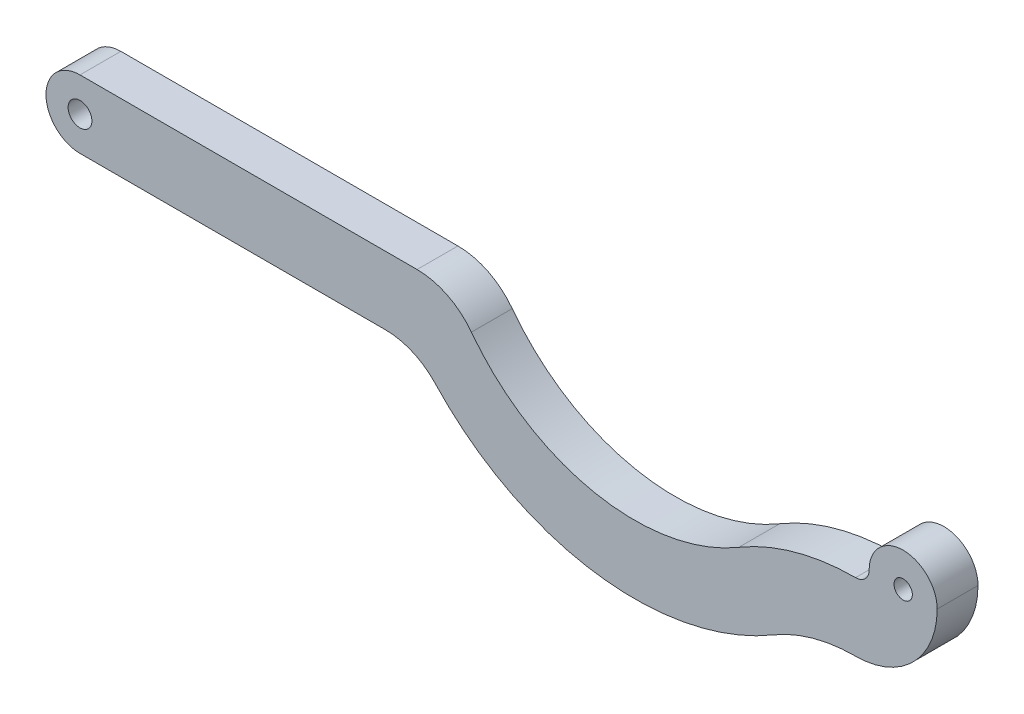
ISO-10303-21;
HEADER;
FILE_DESCRIPTION(('STEP AP214'),'2;1');
FILE_NAME('part.step','',(''),(''),'','','');
FILE_SCHEMA(('AUTOMOTIVE_DESIGN { 1 0 10303 214 1 1 1 1 }'));
ENDSEC;
DATA;
#1=APPLICATION_CONTEXT('core data for automotive mechanical design processes');
#2=APPLICATION_PROTOCOL_DEFINITION('international standard','automotive_design',2000,#1);
#3=PRODUCT_CONTEXT('',#1,'mechanical');
#4=PRODUCT('Part','Part','',(#3));
#5=PRODUCT_RELATED_PRODUCT_CATEGORY('part','',(#4));
#6=PRODUCT_DEFINITION_FORMATION('','',#4);
#7=PRODUCT_DEFINITION_CONTEXT('part definition',#1,'design');
#8=PRODUCT_DEFINITION('design','',#6,#7);
#9=PRODUCT_DEFINITION_SHAPE('','',#8);
#10=(LENGTH_UNIT() NAMED_UNIT(*) SI_UNIT(.MILLI.,.METRE.));
#11=(NAMED_UNIT(*) PLANE_ANGLE_UNIT() SI_UNIT($,.RADIAN.));
#12=(NAMED_UNIT(*) SI_UNIT($,.STERADIAN.) SOLID_ANGLE_UNIT());
#13=UNCERTAINTY_MEASURE_WITH_UNIT(LENGTH_MEASURE(1.E-05),#10,'distance_accuracy_value','');
#14=(GEOMETRIC_REPRESENTATION_CONTEXT(3) GLOBAL_UNCERTAINTY_ASSIGNED_CONTEXT((#13)) GLOBAL_UNIT_ASSIGNED_CONTEXT((#10,
#11,#12)) REPRESENTATION_CONTEXT('',''));
#15=CARTESIAN_POINT('',(0.,0.,0.));
#16=DIRECTION('',(0.,0.,1.));
#17=DIRECTION('',(1.,0.,0.));
#18=AXIS2_PLACEMENT_3D('',#15,#16,#17);
#19=CARTESIAN_POINT('',(114.000002516936,-30.5588194241385,6.));
#20=DIRECTION('',(0.,0.,-1.));
#21=DIRECTION('',(-1.,0.,0.));
#22=AXIS2_PLACEMENT_3D('',#19,#20,#21);
#23=CYLINDRICAL_SURFACE('',#22,23.5588194241386);
#24=CARTESIAN_POINT('',(114.000002516936,-30.5588194241385,0.));
#25=DIRECTION('',(0.,0.,1.));
#26=DIRECTION('',(1.,0.,0.));
#27=AXIS2_PLACEMENT_3D('',#24,#25,#26);
#28=CIRCLE('',#27,23.5588194241386);
#29=CARTESIAN_POINT('',(114.000000849388,-6.99999999999999,0.));
#30=VERTEX_POINT('',#29);
#31=CARTESIAN_POINT('',(101.953496657991,-10.3128403356982,0.));
#32=VERTEX_POINT('',#31);
#33=EDGE_CURVE('E137',#30,#32,#28,.T.);
#34=ORIENTED_EDGE('',*,*,#33,.F.);
#35=DIRECTION('',(0.,0.,-1.));
#36=VECTOR('',#35,1.);
#37=CARTESIAN_POINT('',(114.000000849388,-6.99999999999999,6.));
#38=LINE('',#37,#36);
#39=CARTESIAN_POINT('',(114.000000849388,-6.99999999999999,6.));
#40=VERTEX_POINT('',#39);
#41=EDGE_CURVE('E132',#40,#30,#38,.T.);
#42=ORIENTED_EDGE('',*,*,#41,.F.);
#43=CARTESIAN_POINT('',(114.000002516936,-30.5588194241385,6.));
#44=DIRECTION('',(0.,0.,1.));
#45=DIRECTION('',(1.,0.,0.));
#46=AXIS2_PLACEMENT_3D('',#43,#44,#45);
#47=CIRCLE('',#46,23.5588194241386);
#48=CARTESIAN_POINT('',(101.953496657991,-10.3128403356982,6.));
#49=VERTEX_POINT('',#48);
#50=EDGE_CURVE('E135',#40,#49,#47,.T.);
#51=ORIENTED_EDGE('',*,*,#50,.T.);
#52=DIRECTION('',(0.,0.,-1.));
#53=VECTOR('',#52,1.);
#54=CARTESIAN_POINT('',(101.953496657991,-10.3128403356982,6.));
#55=LINE('',#54,#53);
#56=EDGE_CURVE('E197',#49,#32,#55,.T.);
#57=ORIENTED_EDGE('',*,*,#56,.T.);
#58=EDGE_LOOP('',(#34,#42,#51,#57));
#59=FACE_BOUND('',#58,.T.);
#60=ADVANCED_FACE('F43',(#59),#23,.F.);
#61=CARTESIAN_POINT('',(114.,5.,6.));
#62=DIRECTION('',(0.,0.,-1.));
#63=DIRECTION('',(-1.,0.,0.));
#64=AXIS2_PLACEMENT_3D('',#61,#62,#63);
#65=CYLINDRICAL_SURFACE('',#64,12.);
#66=CARTESIAN_POINT('',(114.,5.,0.));
#67=DIRECTION('',(0.,0.,1.));
#68=DIRECTION('',(1.,0.,0.));
#69=AXIS2_PLACEMENT_3D('',#66,#67,#68);
#70=CIRCLE('',#69,12.);
#71=CARTESIAN_POINT('',(126.,5.,0.));
#72=VERTEX_POINT('',#71);
#73=EDGE_CURVE('E200',#72,#30,#70,.F.);
#74=ORIENTED_EDGE('',*,*,#73,.F.);
#75=DIRECTION('',(0.,0.,-1.));
#76=VECTOR('',#75,1.);
#77=CARTESIAN_POINT('',(126.,5.,6.));
#78=LINE('',#77,#76);
#79=CARTESIAN_POINT('',(126.,5.,6.));
#80=VERTEX_POINT('',#79);
#81=EDGE_CURVE('E144',#80,#72,#78,.T.);
#82=ORIENTED_EDGE('',*,*,#81,.F.);
#83=CARTESIAN_POINT('',(114.,5.,6.));
#84=DIRECTION('',(0.,0.,1.));
#85=DIRECTION('',(1.,0.,0.));
#86=AXIS2_PLACEMENT_3D('',#83,#84,#85);
#87=CIRCLE('',#86,12.);
#88=EDGE_CURVE('E151',#80,#40,#87,.F.);
#89=ORIENTED_EDGE('',*,*,#88,.T.);
#90=ORIENTED_EDGE('',*,*,#41,.T.);
#91=EDGE_LOOP('',(#74,#82,#89,#90));
#92=FACE_BOUND('',#91,.T.);
#93=ADVANCED_FACE('F159',(#92),#65,.T.);
#94=CARTESIAN_POINT('',(121.,5.,6.));
#95=DIRECTION('',(0.,0.,-1.));
#96=DIRECTION('',(-1.,0.,0.));
#97=AXIS2_PLACEMENT_3D('',#94,#95,#96);
#98=CYLINDRICAL_SURFACE('',#97,5.);
#99=CARTESIAN_POINT('',(121.,5.,0.));
#100=DIRECTION('',(0.,0.,1.));
#101=DIRECTION('',(1.,0.,0.));
#102=AXIS2_PLACEMENT_3D('',#99,#100,#101);
#103=CIRCLE('',#102,5.);
#104=CARTESIAN_POINT('',(116.,5.00000000000002,0.));
#105=VERTEX_POINT('',#104);
#106=EDGE_CURVE('E203',#105,#72,#103,.F.);
#107=ORIENTED_EDGE('',*,*,#106,.F.);
#108=DIRECTION('',(0.,0.,-1.));
#109=VECTOR('',#108,1.);
#110=CARTESIAN_POINT('',(116.,5.00000000000002,6.));
#111=LINE('',#110,#109);
#112=CARTESIAN_POINT('',(116.,5.00000000000002,6.));
#113=VERTEX_POINT('',#112);
#114=EDGE_CURVE('E246',#113,#105,#111,.T.);
#115=ORIENTED_EDGE('',*,*,#114,.F.);
#116=CARTESIAN_POINT('',(121.,5.,6.));
#117=DIRECTION('',(0.,0.,1.));
#118=DIRECTION('',(1.,0.,0.));
#119=AXIS2_PLACEMENT_3D('',#116,#117,#118);
#120=CIRCLE('',#119,5.);
#121=EDGE_CURVE('E161',#113,#80,#120,.F.);
#122=ORIENTED_EDGE('',*,*,#121,.T.);
#123=ORIENTED_EDGE('',*,*,#81,.T.);
#124=EDGE_LOOP('',(#107,#115,#122,#123));
#125=FACE_BOUND('',#124,.T.);
#126=ADVANCED_FACE('F302',(#125),#98,.T.);
#127=CARTESIAN_POINT('',(114.,5.,6.));
#128=DIRECTION('',(0.,0.,-1.));
#129=DIRECTION('',(-1.,0.,0.));
#130=AXIS2_PLACEMENT_3D('',#127,#128,#129);
#131=CYLINDRICAL_SURFACE('',#130,2.00000000000009);
#132=CARTESIAN_POINT('',(114.,5.,0.));
#133=DIRECTION('',(0.,0.,1.));
#134=DIRECTION('',(1.,0.,0.));
#135=AXIS2_PLACEMENT_3D('',#132,#133,#134);
#136=CIRCLE('',#135,2.00000000000009);
#137=CARTESIAN_POINT('',(114.000000849388,3.00000000000009,0.));
#138=VERTEX_POINT('',#137);
#139=EDGE_CURVE('E207',#105,#138,#136,.F.);
#140=ORIENTED_EDGE('',*,*,#139,.T.);
#141=DIRECTION('',(0.,0.,-1.));
#142=VECTOR('',#141,1.);
#143=CARTESIAN_POINT('',(114.000000849388,3.00000000000009,6.));
#144=LINE('',#143,#142);
#145=CARTESIAN_POINT('',(114.000000849388,3.00000000000009,6.));
#146=VERTEX_POINT('',#145);
#147=EDGE_CURVE('E243',#146,#138,#144,.T.);
#148=ORIENTED_EDGE('',*,*,#147,.F.);
#149=CARTESIAN_POINT('',(114.,5.,6.));
#150=DIRECTION('',(0.,0.,1.));
#151=DIRECTION('',(1.,0.,0.));
#152=AXIS2_PLACEMENT_3D('',#149,#150,#151);
#153=CIRCLE('',#152,2.00000000000009);
#154=EDGE_CURVE('E164',#113,#146,#153,.F.);
#155=ORIENTED_EDGE('',*,*,#154,.F.);
#156=ORIENTED_EDGE('',*,*,#114,.T.);
#157=EDGE_LOOP('',(#140,#148,#155,#156));
#158=FACE_BOUND('',#157,.T.);
#159=ADVANCED_FACE('F307',(#158),#131,.F.);
#160=CARTESIAN_POINT('',(114.000015101656,-30.5588651860256,6.));
#161=DIRECTION('',(0.,0.,-1.));
#162=DIRECTION('',(-1.,0.,0.));
#163=AXIS2_PLACEMENT_3D('',#160,#161,#162);
#164=CYLINDRICAL_SURFACE('',#163,33.5588651860298);
#165=CARTESIAN_POINT('',(114.000015101656,-30.5588651860256,0.));
#166=DIRECTION('',(0.,0.,1.));
#167=DIRECTION('',(1.,0.,0.));
#168=AXIS2_PLACEMENT_3D('',#165,#166,#167);
#169=CIRCLE('',#168,33.5588651860298);
#170=CARTESIAN_POINT('',(96.8401173887535,-1.71904301152354,0.));
#171=VERTEX_POINT('',#170);
#172=EDGE_CURVE('E211',#171,#138,#169,.F.);
#173=ORIENTED_EDGE('',*,*,#172,.F.);
#174=DIRECTION('',(0.,0.,-1.));
#175=VECTOR('',#174,1.);
#176=CARTESIAN_POINT('',(96.8401173887535,-1.71904301152354,6.));
#177=LINE('',#176,#175);
#178=CARTESIAN_POINT('',(96.8401173887535,-1.71904301152354,6.));
#179=VERTEX_POINT('',#178);
#180=EDGE_CURVE('E239',#179,#171,#177,.T.);
#181=ORIENTED_EDGE('',*,*,#180,.F.);
#182=CARTESIAN_POINT('',(114.000015101656,-30.5588651860256,6.));
#183=DIRECTION('',(0.,0.,1.));
#184=DIRECTION('',(1.,0.,0.));
#185=AXIS2_PLACEMENT_3D('',#182,#183,#184);
#186=CIRCLE('',#185,33.5588651860298);
#187=EDGE_CURVE('E169',#179,#146,#186,.F.);
#188=ORIENTED_EDGE('',*,*,#187,.T.);
#189=ORIENTED_EDGE('',*,*,#147,.T.);
#190=EDGE_LOOP('',(#173,#181,#188,#189));
#191=FACE_BOUND('',#190,.T.);
#192=ADVANCED_FACE('F311',(#191),#164,.T.);
#193=CARTESIAN_POINT('',(81.5,24.0623611104252,6.));
#194=DIRECTION('',(0.,0.,-1.));
#195=DIRECTION('',(-1.,0.,0.));
#196=AXIS2_PLACEMENT_3D('',#193,#194,#195);
#197=CYLINDRICAL_SURFACE('',#196,29.9999999999996);
#198=CARTESIAN_POINT('',(81.5,24.0623611104252,0.));
#199=DIRECTION('',(0.,0.,1.));
#200=DIRECTION('',(1.,0.,0.));
#201=AXIS2_PLACEMENT_3D('',#198,#199,#200);
#202=CIRCLE('',#201,29.9999999999996);
#203=CARTESIAN_POINT('',(57.5351494369839,6.01559027760638,0.));
#204=VERTEX_POINT('',#203);
#205=EDGE_CURVE('E215',#204,#171,#202,.T.);
#206=ORIENTED_EDGE('',*,*,#205,.F.);
#207=DIRECTION('',(0.,0.,-1.));
#208=VECTOR('',#207,1.);
#209=CARTESIAN_POINT('',(57.5351494369839,6.01559027760638,6.));
#210=LINE('',#209,#208);
#211=CARTESIAN_POINT('',(57.5351494369839,6.01559027760638,6.));
#212=VERTEX_POINT('',#211);
#213=EDGE_CURVE('E59',#204,#212,#210,.F.);
#214=ORIENTED_EDGE('',*,*,#213,.T.);
#215=CARTESIAN_POINT('',(81.5,24.0623611104252,6.));
#216=DIRECTION('',(0.,0.,1.));
#217=DIRECTION('',(1.,0.,0.));
#218=AXIS2_PLACEMENT_3D('',#215,#216,#217);
#219=CIRCLE('',#218,29.9999999999996);
#220=EDGE_CURVE('E173',#212,#179,#219,.T.);
#221=ORIENTED_EDGE('',*,*,#220,.T.);
#222=ORIENTED_EDGE('',*,*,#180,.T.);
#223=EDGE_LOOP('',(#206,#214,#221,#222));
#224=FACE_BOUND('',#223,.T.);
#225=ADVANCED_FACE('F312',(#224),#197,.F.);
#226=CARTESIAN_POINT('',(0.,10.,6.));
#227=DIRECTION('',(0.,1.,0.));
#228=DIRECTION('',(0.,0.,1.));
#229=AXIS2_PLACEMENT_3D('',#226,#227,#228);
#230=PLANE('',#229);
#231=DIRECTION('',(1.,0.,0.));
#232=VECTOR('',#231,1.);
#233=CARTESIAN_POINT('',(0.,10.,6.));
#234=LINE('',#233,#232);
#235=CARTESIAN_POINT('',(0.,10.,6.));
#236=VERTEX_POINT('',#235);
#237=CARTESIAN_POINT('',(49.5468659159784,10.,6.));
#238=VERTEX_POINT('',#237);
#239=EDGE_CURVE('E176',#236,#238,#234,.T.);
#240=ORIENTED_EDGE('',*,*,#239,.T.);
#241=DIRECTION('',(0.,0.,-1.));
#242=VECTOR('',#241,1.);
#243=CARTESIAN_POINT('',(49.5468659159784,10.,6.));
#244=LINE('',#243,#242);
#245=CARTESIAN_POINT('',(49.5468659159784,10.,0.));
#246=VERTEX_POINT('',#245);
#247=EDGE_CURVE('E273',#238,#246,#244,.T.);
#248=ORIENTED_EDGE('',*,*,#247,.T.);
#249=DIRECTION('',(1.,0.,0.));
#250=VECTOR('',#249,1.);
#251=CARTESIAN_POINT('',(0.,10.,0.));
#252=LINE('',#251,#250);
#253=CARTESIAN_POINT('',(0.,10.,0.));
#254=VERTEX_POINT('',#253);
#255=EDGE_CURVE('E218',#254,#246,#252,.T.);
#256=ORIENTED_EDGE('',*,*,#255,.F.);
#257=DIRECTION('',(0.,0.,-1.));
#258=VECTOR('',#257,1.);
#259=CARTESIAN_POINT('',(0.,10.,6.));
#260=LINE('',#259,#258);
#261=EDGE_CURVE('E236',#236,#254,#260,.T.);
#262=ORIENTED_EDGE('',*,*,#261,.F.);
#263=EDGE_LOOP('',(#240,#248,#256,#262));
#264=FACE_BOUND('',#263,.T.);
#265=ADVANCED_FACE('F319',(#264),#230,.T.);
#266=CARTESIAN_POINT('',(0.,5.,6.));
#267=DIRECTION('',(0.,0.,-1.));
#268=DIRECTION('',(-1.,0.,0.));
#269=AXIS2_PLACEMENT_3D('',#266,#267,#268);
#270=CYLINDRICAL_SURFACE('',#269,5.);
#271=CARTESIAN_POINT('',(0.,5.,0.));
#272=DIRECTION('',(0.,0.,1.));
#273=DIRECTION('',(1.,0.,0.));
#274=AXIS2_PLACEMENT_3D('',#271,#272,#273);
#275=CIRCLE('',#274,5.);
#276=CARTESIAN_POINT('',(0.,0.,0.));
#277=VERTEX_POINT('',#276);
#278=EDGE_CURVE('E221',#254,#277,#275,.T.);
#279=ORIENTED_EDGE('',*,*,#278,.T.);
#280=DIRECTION('',(0.,0.,-1.));
#281=VECTOR('',#280,1.);
#282=CARTESIAN_POINT('',(0.,0.,6.));
#283=LINE('',#282,#281);
#284=CARTESIAN_POINT('',(0.,0.,6.));
#285=VERTEX_POINT('',#284);
#286=EDGE_CURVE('E232',#285,#277,#283,.T.);
#287=ORIENTED_EDGE('',*,*,#286,.F.);
#288=CARTESIAN_POINT('',(0.,5.,6.));
#289=DIRECTION('',(0.,0.,1.));
#290=DIRECTION('',(1.,0.,0.));
#291=AXIS2_PLACEMENT_3D('',#288,#289,#290);
#292=CIRCLE('',#291,5.);
#293=EDGE_CURVE('E180',#236,#285,#292,.T.);
#294=ORIENTED_EDGE('',*,*,#293,.F.);
#295=ORIENTED_EDGE('',*,*,#261,.T.);
#296=EDGE_LOOP('',(#279,#287,#294,#295));
#297=FACE_BOUND('',#296,.T.);
#298=ADVANCED_FACE('F321',(#297),#270,.T.);
#299=CARTESIAN_POINT('',(0.,0.,6.));
#300=DIRECTION('',(0.,1.,0.));
#301=DIRECTION('',(0.,0.,1.));
#302=AXIS2_PLACEMENT_3D('',#299,#300,#301);
#303=PLANE('',#302);
#304=DIRECTION('',(1.,0.,0.));
#305=VECTOR('',#304,1.);
#306=CARTESIAN_POINT('',(0.,0.,0.));
#307=LINE('',#306,#305);
#308=CARTESIAN_POINT('',(44.8973285731357,0.,0.));
#309=VERTEX_POINT('',#308);
#310=EDGE_CURVE('E224',#277,#309,#307,.T.);
#311=ORIENTED_EDGE('',*,*,#310,.T.);
#312=DIRECTION('',(0.,0.,1.));
#313=VECTOR('',#312,1.);
#314=CARTESIAN_POINT('',(44.8973285731357,0.,6.));
#315=LINE('',#314,#313);
#316=CARTESIAN_POINT('',(44.8973285731357,0.,6.));
#317=VERTEX_POINT('',#316);
#318=EDGE_CURVE('E270',#309,#317,#315,.T.);
#319=ORIENTED_EDGE('',*,*,#318,.T.);
#320=DIRECTION('',(1.,0.,0.));
#321=VECTOR('',#320,1.);
#322=CARTESIAN_POINT('',(0.,0.,6.));
#323=LINE('',#322,#321);
#324=EDGE_CURVE('E183',#285,#317,#323,.T.);
#325=ORIENTED_EDGE('',*,*,#324,.F.);
#326=ORIENTED_EDGE('',*,*,#286,.T.);
#327=EDGE_LOOP('',(#311,#319,#325,#326));
#328=FACE_BOUND('',#327,.T.);
#329=ADVANCED_FACE('F292',(#328),#303,.F.);
#330=CARTESIAN_POINT('',(121.,5.,6.));
#331=DIRECTION('',(0.,0.,-1.));
#332=DIRECTION('',(-1.,0.,0.));
#333=AXIS2_PLACEMENT_3D('',#330,#331,#332);
#334=CYLINDRICAL_SURFACE('',#333,1.35000000000001);
#335=CARTESIAN_POINT('',(121.,5.,1.24999999999999));
#336=DIRECTION('',(0.,0.,1.));
#337=DIRECTION('',(1.,0.,0.));
#338=AXIS2_PLACEMENT_3D('',#335,#336,#337);
#339=CIRCLE('',#338,1.35000000000001);
#340=CARTESIAN_POINT('',(122.35,5.,1.24999999999999));
#341=VERTEX_POINT('',#340);
#342=EDGE_CURVE('E262',#341,#341,#339,.F.);
#343=ORIENTED_EDGE('',*,*,#342,.T.);
#344=EDGE_LOOP('',(#343));
#345=FACE_BOUND('',#344,.T.);
#346=CARTESIAN_POINT('',(121.,5.,6.));
#347=DIRECTION('',(0.,0.,1.));
#348=DIRECTION('',(1.,0.,0.));
#349=AXIS2_PLACEMENT_3D('',#346,#347,#348);
#350=CIRCLE('',#349,1.35000000000001);
#351=CARTESIAN_POINT('',(122.35,5.,6.));
#352=VERTEX_POINT('',#351);
#353=EDGE_CURVE('E189',#352,#352,#350,.T.);
#354=ORIENTED_EDGE('',*,*,#353,.T.);
#355=EDGE_LOOP('',(#354));
#356=FACE_BOUND('',#355,.T.);
#357=ADVANCED_FACE('F329',(#345,#356),#334,.F.);
#358=CARTESIAN_POINT('',(81.5,24.0623611104252,6.));
#359=DIRECTION('',(0.,0.,-1.));
#360=DIRECTION('',(-1.,0.,0.));
#361=AXIS2_PLACEMENT_3D('',#358,#359,#360);
#362=CYLINDRICAL_SURFACE('',#361,40.);
#363=CARTESIAN_POINT('',(81.5,24.0623611104252,6.));
#364=DIRECTION('',(0.,0.,1.));
#365=DIRECTION('',(1.,0.,0.));
#366=AXIS2_PLACEMENT_3D('',#363,#364,#365);
#367=CIRCLE('',#366,40.);
#368=CARTESIAN_POINT('',(52.2178628585085,-3.18752777791495,6.));
#369=VERTEX_POINT('',#368);
#370=EDGE_CURVE('E154',#369,#49,#367,.T.);
#371=ORIENTED_EDGE('',*,*,#370,.F.);
#372=DIRECTION('',(0.,0.,-1.));
#373=VECTOR('',#372,1.);
#374=CARTESIAN_POINT('',(52.2178628585085,-3.18752777791495,6.));
#375=LINE('',#374,#373);
#376=CARTESIAN_POINT('',(52.2178628585085,-3.18752777791495,0.));
#377=VERTEX_POINT('',#376);
#378=EDGE_CURVE('E266',#369,#377,#375,.T.);
#379=ORIENTED_EDGE('',*,*,#378,.T.);
#380=CARTESIAN_POINT('',(81.5,24.0623611104252,0.));
#381=DIRECTION('',(0.,0.,1.));
#382=DIRECTION('',(1.,0.,0.));
#383=AXIS2_PLACEMENT_3D('',#380,#381,#382);
#384=CIRCLE('',#383,40.);
#385=EDGE_CURVE('E157',#377,#32,#384,.T.);
#386=ORIENTED_EDGE('',*,*,#385,.T.);
#387=ORIENTED_EDGE('',*,*,#56,.F.);
#388=EDGE_LOOP('',(#371,#379,#386,#387));
#389=FACE_BOUND('',#388,.T.);
#390=ADVANCED_FACE('F298',(#389),#362,.T.);
#391=CARTESIAN_POINT('',(0.,5.,6.));
#392=DIRECTION('',(0.,0.,-1.));
#393=DIRECTION('',(-1.,0.,0.));
#394=AXIS2_PLACEMENT_3D('',#391,#392,#393);
#395=CYLINDRICAL_SURFACE('',#394,1.75);
#396=CARTESIAN_POINT('',(0.,5.,1.25000000000001));
#397=DIRECTION('',(0.,0.,1.));
#398=DIRECTION('',(1.,0.,0.));
#399=AXIS2_PLACEMENT_3D('',#396,#397,#398);
#400=CIRCLE('',#399,1.75);
#401=CARTESIAN_POINT('',(1.75,5.,1.25000000000001));
#402=VERTEX_POINT('',#401);
#403=EDGE_CURVE('E258',#402,#402,#400,.F.);
#404=ORIENTED_EDGE('',*,*,#403,.T.);
#405=EDGE_LOOP('',(#404));
#406=FACE_BOUND('',#405,.T.);
#407=CARTESIAN_POINT('',(0.,5.,6.));
#408=DIRECTION('',(0.,0.,1.));
#409=DIRECTION('',(1.,0.,0.));
#410=AXIS2_PLACEMENT_3D('',#407,#408,#409);
#411=CIRCLE('',#410,1.75);
#412=CARTESIAN_POINT('',(1.75,5.,6.));
#413=VERTEX_POINT('',#412);
#414=EDGE_CURVE('E193',#413,#413,#411,.T.);
#415=ORIENTED_EDGE('',*,*,#414,.T.);
#416=EDGE_LOOP('',(#415));
#417=FACE_BOUND('',#416,.T.);
#418=ADVANCED_FACE('F383',(#406,#417),#395,.F.);
#419=CARTESIAN_POINT('',(0.,0.,6.));
#420=DIRECTION('',(0.,0.,1.));
#421=DIRECTION('',(1.,0.,0.));
#422=AXIS2_PLACEMENT_3D('',#419,#420,#421);
#423=PLANE('',#422);
#424=ORIENTED_EDGE('',*,*,#220,.F.);
#425=CARTESIAN_POINT('',(49.5468659159784,0.,6.));
#426=DIRECTION('',(0.,0.,1.));
#427=DIRECTION('',(1.,0.,0.));
#428=AXIS2_PLACEMENT_3D('',#425,#426,#427);
#429=CIRCLE('',#428,10.);
#430=EDGE_CURVE('E281',#212,#238,#429,.T.);
#431=ORIENTED_EDGE('',*,*,#430,.T.);
#432=ORIENTED_EDGE('',*,*,#239,.F.);
#433=ORIENTED_EDGE('',*,*,#293,.T.);
#434=ORIENTED_EDGE('',*,*,#324,.T.);
#435=CARTESIAN_POINT('',(44.8973285731357,-10.,6.));
#436=DIRECTION('',(0.,0.,1.));
#437=DIRECTION('',(1.,0.,0.));
#438=AXIS2_PLACEMENT_3D('',#435,#436,#437);
#439=CIRCLE('',#438,10.);
#440=EDGE_CURVE('E11',#317,#369,#439,.F.);
#441=ORIENTED_EDGE('',*,*,#440,.T.);
#442=ORIENTED_EDGE('',*,*,#370,.T.);
#443=ORIENTED_EDGE('',*,*,#50,.F.);
#444=ORIENTED_EDGE('',*,*,#88,.F.);
#445=ORIENTED_EDGE('',*,*,#121,.F.);
#446=ORIENTED_EDGE('',*,*,#154,.T.);
#447=ORIENTED_EDGE('',*,*,#187,.F.);
#448=EDGE_LOOP('',(#424,#431,#432,#433,#434,#441,#442,#443,#444,#445,#446,#447));
#449=FACE_BOUND('',#448,.T.);
#450=ORIENTED_EDGE('',*,*,#353,.F.);
#451=EDGE_LOOP('',(#450));
#452=FACE_BOUND('',#451,.T.);
#453=ORIENTED_EDGE('',*,*,#414,.F.);
#454=EDGE_LOOP('',(#453));
#455=FACE_BOUND('',#454,.T.);
#456=ADVANCED_FACE('F148',(#449,#452,#455),#423,.T.);
#457=CARTESIAN_POINT('',(0.,0.,0.));
#458=DIRECTION('',(0.,0.,1.));
#459=DIRECTION('',(1.,0.,0.));
#460=AXIS2_PLACEMENT_3D('',#457,#458,#459);
#461=PLANE('',#460);
#462=CARTESIAN_POINT('',(0.,5.,0.));
#463=DIRECTION('',(0.,0.,1.));
#464=DIRECTION('',(1.,0.,0.));
#465=AXIS2_PLACEMENT_3D('',#462,#463,#464);
#466=CIRCLE('',#465,3.);
#467=CARTESIAN_POINT('',(3.,5.,0.));
#468=VERTEX_POINT('',#467);
#469=EDGE_CURVE('E254',#468,#468,#466,.T.);
#470=ORIENTED_EDGE('',*,*,#469,.T.);
#471=EDGE_LOOP('',(#470));
#472=FACE_BOUND('',#471,.T.);
#473=CARTESIAN_POINT('',(121.,5.,0.));
#474=DIRECTION('',(0.,0.,1.));
#475=DIRECTION('',(1.,0.,0.));
#476=AXIS2_PLACEMENT_3D('',#473,#474,#475);
#477=CIRCLE('',#476,2.6);
#478=CARTESIAN_POINT('',(123.6,5.,0.));
#479=VERTEX_POINT('',#478);
#480=EDGE_CURVE('E143',#479,#479,#477,.T.);
#481=ORIENTED_EDGE('',*,*,#480,.T.);
#482=EDGE_LOOP('',(#481));
#483=FACE_BOUND('',#482,.T.);
#484=ORIENTED_EDGE('',*,*,#255,.T.);
#485=CARTESIAN_POINT('',(49.5468659159784,0.,0.));
#486=DIRECTION('',(0.,0.,1.));
#487=DIRECTION('',(1.,0.,0.));
#488=AXIS2_PLACEMENT_3D('',#485,#486,#487);
#489=CIRCLE('',#488,10.);
#490=EDGE_CURVE('E67',#246,#204,#489,.F.);
#491=ORIENTED_EDGE('',*,*,#490,.T.);
#492=ORIENTED_EDGE('',*,*,#205,.T.);
#493=ORIENTED_EDGE('',*,*,#172,.T.);
#494=ORIENTED_EDGE('',*,*,#139,.F.);
#495=ORIENTED_EDGE('',*,*,#106,.T.);
#496=ORIENTED_EDGE('',*,*,#73,.T.);
#497=ORIENTED_EDGE('',*,*,#33,.T.);
#498=ORIENTED_EDGE('',*,*,#385,.F.);
#499=CARTESIAN_POINT('',(44.8973285731357,-10.,0.));
#500=DIRECTION('',(0.,0.,1.));
#501=DIRECTION('',(1.,0.,0.));
#502=AXIS2_PLACEMENT_3D('',#499,#500,#501);
#503=CIRCLE('',#502,10.);
#504=EDGE_CURVE('E52',#377,#309,#503,.T.);
#505=ORIENTED_EDGE('',*,*,#504,.T.);
#506=ORIENTED_EDGE('',*,*,#310,.F.);
#507=ORIENTED_EDGE('',*,*,#278,.F.);
#508=EDGE_LOOP('',(#484,#491,#492,#493,#494,#495,#496,#497,#498,#505,#506,#507));
#509=FACE_BOUND('',#508,.T.);
#510=ADVANCED_FACE('F286',(#472,#483,#509),#461,.F.);
#511=CARTESIAN_POINT('',(0.,5.,0.));
#512=DIRECTION('',(0.,0.,-1.));
#513=DIRECTION('',(-1.,0.,0.));
#514=AXIS2_PLACEMENT_3D('',#511,#512,#513);
#515=CONICAL_SURFACE('',#514,3.,0.785398163397445);
#516=ORIENTED_EDGE('',*,*,#403,.F.);
#517=EDGE_LOOP('',(#516));
#518=FACE_BOUND('',#517,.T.);
#519=ORIENTED_EDGE('',*,*,#469,.F.);
#520=EDGE_LOOP('',(#519));
#521=FACE_BOUND('',#520,.T.);
#522=ADVANCED_FACE('F341',(#518,#521),#515,.F.);
#523=CARTESIAN_POINT('',(121.,5.,0.));
#524=DIRECTION('',(0.,0.,-1.));
#525=DIRECTION('',(-1.,0.,0.));
#526=AXIS2_PLACEMENT_3D('',#523,#524,#525);
#527=CONICAL_SURFACE('',#526,2.6,0.785398163397452);
#528=ORIENTED_EDGE('',*,*,#342,.F.);
#529=EDGE_LOOP('',(#528));
#530=FACE_BOUND('',#529,.T.);
#531=ORIENTED_EDGE('',*,*,#480,.F.);
#532=EDGE_LOOP('',(#531));
#533=FACE_BOUND('',#532,.T.);
#534=ADVANCED_FACE('F347',(#530,#533),#527,.F.);
#535=CARTESIAN_POINT('',(44.8973285731357,-10.,6.));
#536=DIRECTION('',(0.,0.,-1.));
#537=DIRECTION('',(-1.,0.,0.));
#538=AXIS2_PLACEMENT_3D('',#535,#536,#537);
#539=CYLINDRICAL_SURFACE('',#538,10.);
#540=ORIENTED_EDGE('',*,*,#440,.F.);
#541=ORIENTED_EDGE('',*,*,#318,.F.);
#542=ORIENTED_EDGE('',*,*,#504,.F.);
#543=ORIENTED_EDGE('',*,*,#378,.F.);
#544=EDGE_LOOP('',(#540,#541,#542,#543));
#545=FACE_BOUND('',#544,.T.);
#546=ADVANCED_FACE('F296',(#545),#539,.F.);
#547=CARTESIAN_POINT('',(49.5468659159784,0.,6.));
#548=DIRECTION('',(0.,0.,-1.));
#549=DIRECTION('',(-1.,0.,0.));
#550=AXIS2_PLACEMENT_3D('',#547,#548,#549);
#551=CYLINDRICAL_SURFACE('',#550,10.);
#552=ORIENTED_EDGE('',*,*,#430,.F.);
#553=ORIENTED_EDGE('',*,*,#213,.F.);
#554=ORIENTED_EDGE('',*,*,#490,.F.);
#555=ORIENTED_EDGE('',*,*,#247,.F.);
#556=EDGE_LOOP('',(#552,#553,#554,#555));
#557=FACE_BOUND('',#556,.T.);
#558=ADVANCED_FACE('F45',(#557),#551,.T.);
#559=CLOSED_SHELL('',(#60,#93,#126,#159,#192,#225,#265,#298,#329,#357,#390,#418,#456,#510,#522,
#534,#546,#558));
#560=MANIFOLD_SOLID_BREP('B2',#559);
#561=ADVANCED_BREP_SHAPE_REPRESENTATION('',(#18,#560),#14);
#562=SHAPE_DEFINITION_REPRESENTATION(#9,#561);
ENDSEC;
END-ISO-10303-21;
